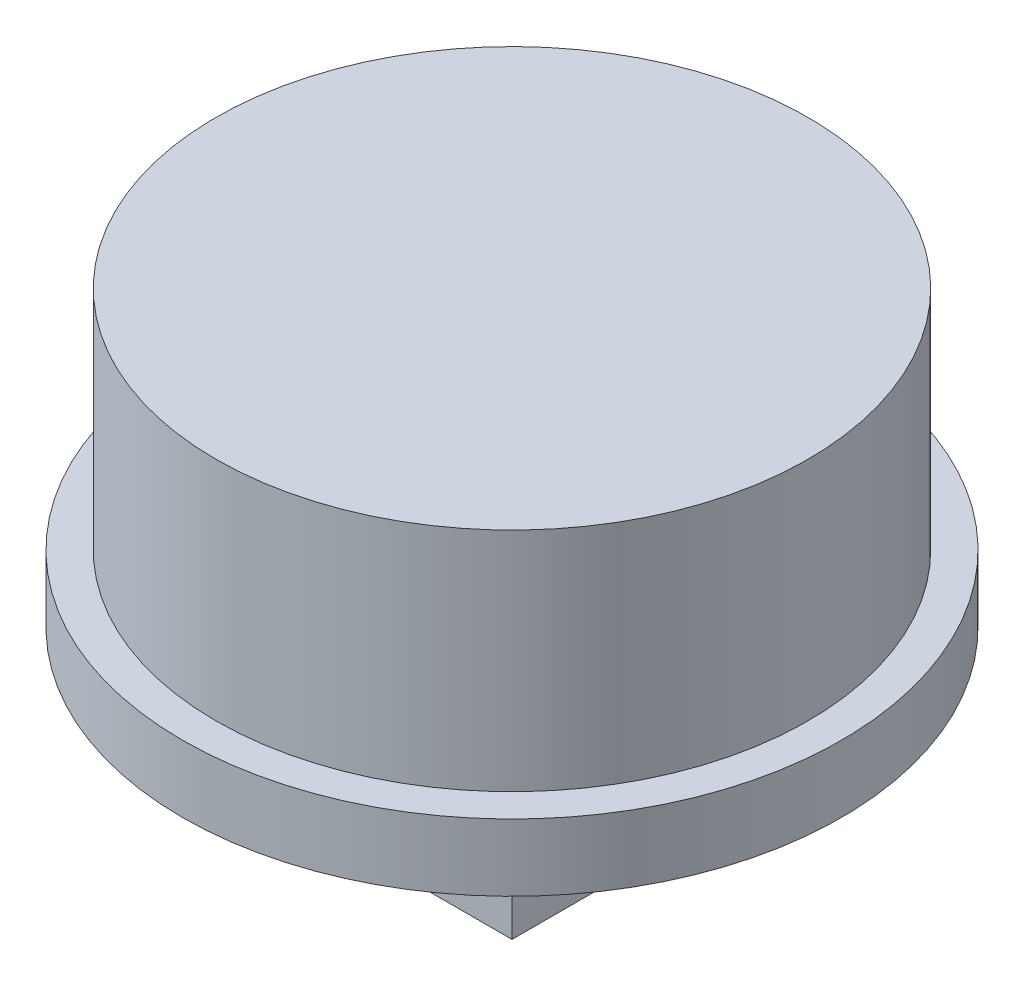
ISO-10303-21;
HEADER;
FILE_DESCRIPTION(('STEP AP214'),'2;1');
FILE_NAME('part.step','',(''),(''),'','','');
FILE_SCHEMA(('AUTOMOTIVE_DESIGN { 1 0 10303 214 1 1 1 1 }'));
ENDSEC;
DATA;
#1=APPLICATION_CONTEXT('core data for automotive mechanical design processes');
#2=APPLICATION_PROTOCOL_DEFINITION('international standard','automotive_design',2000,#1);
#3=PRODUCT_CONTEXT('',#1,'mechanical');
#4=PRODUCT('Part','Part','',(#3));
#5=PRODUCT_RELATED_PRODUCT_CATEGORY('part','',(#4));
#6=PRODUCT_DEFINITION_FORMATION('','',#4);
#7=PRODUCT_DEFINITION_CONTEXT('part definition',#1,'design');
#8=PRODUCT_DEFINITION('design','',#6,#7);
#9=PRODUCT_DEFINITION_SHAPE('','',#8);
#10=(LENGTH_UNIT() NAMED_UNIT(*) SI_UNIT(.MILLI.,.METRE.));
#11=(NAMED_UNIT(*) PLANE_ANGLE_UNIT() SI_UNIT($,.RADIAN.));
#12=(NAMED_UNIT(*) SI_UNIT($,.STERADIAN.) SOLID_ANGLE_UNIT());
#13=UNCERTAINTY_MEASURE_WITH_UNIT(LENGTH_MEASURE(1.E-05),#10,'distance_accuracy_value','');
#14=(GEOMETRIC_REPRESENTATION_CONTEXT(3) GLOBAL_UNCERTAINTY_ASSIGNED_CONTEXT((#13)) GLOBAL_UNIT_ASSIGNED_CONTEXT((#10,
#11,#12)) REPRESENTATION_CONTEXT('',''));
#15=CARTESIAN_POINT('',(0.,0.,0.));
#16=DIRECTION('',(0.,0.,1.));
#17=DIRECTION('',(1.,0.,0.));
#18=AXIS2_PLACEMENT_3D('',#15,#16,#17);
#19=CARTESIAN_POINT('',(0.,1.3,0.));
#20=DIRECTION('',(0.,-1.,0.));
#21=DIRECTION('',(0.,0.,-1.));
#22=AXIS2_PLACEMENT_3D('',#19,#20,#21);
#23=CYLINDRICAL_SURFACE('',#22,6.4);
#24=CARTESIAN_POINT('',(0.,1.3,0.));
#25=DIRECTION('',(0.,1.,0.));
#26=DIRECTION('',(0.,0.,1.));
#27=AXIS2_PLACEMENT_3D('',#24,#25,#26);
#28=CIRCLE('',#27,6.4);
#29=CARTESIAN_POINT('',(0.,1.3,6.4));
#30=VERTEX_POINT('',#29);
#31=EDGE_CURVE('E11',#30,#30,#28,.T.);
#32=ORIENTED_EDGE('',*,*,#31,.F.);
#33=EDGE_LOOP('',(#32));
#34=FACE_BOUND('',#33,.T.);
#35=CARTESIAN_POINT('',(0.,0.,0.));
#36=DIRECTION('',(0.,1.,0.));
#37=DIRECTION('',(0.,0.,1.));
#38=AXIS2_PLACEMENT_3D('',#35,#36,#37);
#39=CIRCLE('',#38,6.4);
#40=CARTESIAN_POINT('',(0.,0.,6.4));
#41=VERTEX_POINT('',#40);
#42=EDGE_CURVE('E41',#41,#41,#39,.T.);
#43=ORIENTED_EDGE('',*,*,#42,.T.);
#44=EDGE_LOOP('',(#43));
#45=FACE_BOUND('',#44,.T.);
#46=ADVANCED_FACE('F38',(#34,#45),#23,.T.);
#47=CARTESIAN_POINT('',(0.,1.3,0.));
#48=DIRECTION('',(0.,1.,0.));
#49=DIRECTION('',(0.,0.,1.));
#50=AXIS2_PLACEMENT_3D('',#47,#48,#49);
#51=PLANE('',#50);
#52=CARTESIAN_POINT('',(0.,1.3,0.));
#53=DIRECTION('',(0.,1.,0.));
#54=DIRECTION('',(0.,0.,1.));
#55=AXIS2_PLACEMENT_3D('',#52,#53,#54);
#56=CIRCLE('',#55,5.75);
#57=CARTESIAN_POINT('',(0.,1.3,5.75));
#58=VERTEX_POINT('',#57);
#59=EDGE_CURVE('E177',#58,#58,#56,.F.);
#60=ORIENTED_EDGE('',*,*,#59,.T.);
#61=EDGE_LOOP('',(#60));
#62=FACE_BOUND('',#61,.T.);
#63=ORIENTED_EDGE('',*,*,#31,.T.);
#64=EDGE_LOOP('',(#63));
#65=FACE_BOUND('',#64,.T.);
#66=ADVANCED_FACE('F188',(#62,#65),#51,.T.);
#67=CARTESIAN_POINT('',(0.,0.,0.));
#68=DIRECTION('',(0.,1.,0.));
#69=DIRECTION('',(0.,0.,1.));
#70=AXIS2_PLACEMENT_3D('',#67,#68,#69);
#71=PLANE('',#70);
#72=DIRECTION('',(-1.,0.,0.));
#73=VECTOR('',#72,1.);
#74=CARTESIAN_POINT('',(2.75,0.,-2.75));
#75=LINE('',#74,#73);
#76=CARTESIAN_POINT('',(2.75,0.,-2.75));
#77=VERTEX_POINT('',#76);
#78=CARTESIAN_POINT('',(-2.75,0.,-2.75));
#79=VERTEX_POINT('',#78);
#80=EDGE_CURVE('E149',#77,#79,#75,.T.);
#81=ORIENTED_EDGE('',*,*,#80,.T.);
#82=DIRECTION('',(0.,0.,1.));
#83=VECTOR('',#82,1.);
#84=CARTESIAN_POINT('',(-2.75,0.,-2.75));
#85=LINE('',#84,#83);
#86=CARTESIAN_POINT('',(-2.75,0.,2.75));
#87=VERTEX_POINT('',#86);
#88=EDGE_CURVE('E140',#79,#87,#85,.T.);
#89=ORIENTED_EDGE('',*,*,#88,.T.);
#90=DIRECTION('',(1.,0.,0.));
#91=VECTOR('',#90,1.);
#92=CARTESIAN_POINT('',(2.75,0.,2.75));
#93=LINE('',#92,#91);
#94=CARTESIAN_POINT('',(2.75,0.,2.75));
#95=VERTEX_POINT('',#94);
#96=EDGE_CURVE('E161',#87,#95,#93,.T.);
#97=ORIENTED_EDGE('',*,*,#96,.T.);
#98=DIRECTION('',(0.,0.,-1.));
#99=VECTOR('',#98,1.);
#100=CARTESIAN_POINT('',(2.75,0.,-2.75));
#101=LINE('',#100,#99);
#102=EDGE_CURVE('E52',#95,#77,#101,.T.);
#103=ORIENTED_EDGE('',*,*,#102,.T.);
#104=EDGE_LOOP('',(#81,#89,#97,#103));
#105=FACE_BOUND('',#104,.T.);
#106=ORIENTED_EDGE('',*,*,#42,.F.);
#107=EDGE_LOOP('',(#106));
#108=FACE_BOUND('',#107,.T.);
#109=ADVANCED_FACE('F185',(#105,#108),#71,.F.);
#110=CARTESIAN_POINT('',(0.,5.7,0.));
#111=DIRECTION('',(0.,-1.,0.));
#112=DIRECTION('',(0.,0.,-1.));
#113=AXIS2_PLACEMENT_3D('',#110,#111,#112);
#114=CYLINDRICAL_SURFACE('',#113,5.75);
#115=ORIENTED_EDGE('',*,*,#59,.F.);
#116=EDGE_LOOP('',(#115));
#117=FACE_BOUND('',#116,.T.);
#118=CARTESIAN_POINT('',(0.,5.7,0.));
#119=DIRECTION('',(0.,1.,0.));
#120=DIRECTION('',(0.,0.,1.));
#121=AXIS2_PLACEMENT_3D('',#118,#119,#120);
#122=CIRCLE('',#121,5.75);
#123=CARTESIAN_POINT('',(0.,5.7,5.75));
#124=VERTEX_POINT('',#123);
#125=EDGE_CURVE('E169',#124,#124,#122,.T.);
#126=ORIENTED_EDGE('',*,*,#125,.F.);
#127=EDGE_LOOP('',(#126));
#128=FACE_BOUND('',#127,.T.);
#129=ADVANCED_FACE('F187',(#117,#128),#114,.T.);
#130=CARTESIAN_POINT('',(0.,5.7,0.));
#131=DIRECTION('',(0.,1.,0.));
#132=DIRECTION('',(0.,0.,1.));
#133=AXIS2_PLACEMENT_3D('',#130,#131,#132);
#134=PLANE('',#133);
#135=ORIENTED_EDGE('',*,*,#125,.T.);
#136=EDGE_LOOP('',(#135));
#137=FACE_BOUND('',#136,.T.);
#138=ADVANCED_FACE('F195',(#137),#134,.T.);
#139=CARTESIAN_POINT('',(-2.75,-2.5,-2.75));
#140=DIRECTION('',(-1.,0.,0.));
#141=DIRECTION('',(0.,0.,1.));
#142=AXIS2_PLACEMENT_3D('',#139,#140,#141);
#143=PLANE('',#142);
#144=ORIENTED_EDGE('',*,*,#88,.F.);
#145=DIRECTION('',(0.,1.,0.));
#146=VECTOR('',#145,1.);
#147=CARTESIAN_POINT('',(-2.75,-2.5,-2.75));
#148=LINE('',#147,#146);
#149=CARTESIAN_POINT('',(-2.75,-2.5,-2.75));
#150=VERTEX_POINT('',#149);
#151=EDGE_CURVE('E167',#150,#79,#148,.T.);
#152=ORIENTED_EDGE('',*,*,#151,.F.);
#153=DIRECTION('',(0.,0.,1.));
#154=VECTOR('',#153,1.);
#155=CARTESIAN_POINT('',(-2.75,-2.5,-2.75));
#156=LINE('',#155,#154);
#157=CARTESIAN_POINT('',(-2.75,-2.5,2.75));
#158=VERTEX_POINT('',#157);
#159=EDGE_CURVE('E145',#150,#158,#156,.T.);
#160=ORIENTED_EDGE('',*,*,#159,.T.);
#161=DIRECTION('',(0.,1.,0.));
#162=VECTOR('',#161,1.);
#163=CARTESIAN_POINT('',(-2.75,-2.5,2.75));
#164=LINE('',#163,#162);
#165=EDGE_CURVE('E158',#158,#87,#164,.T.);
#166=ORIENTED_EDGE('',*,*,#165,.T.);
#167=EDGE_LOOP('',(#144,#152,#160,#166));
#168=FACE_BOUND('',#167,.T.);
#169=ADVANCED_FACE('F225',(#168),#143,.T.);
#170=CARTESIAN_POINT('',(2.75,-2.5,-2.75));
#171=DIRECTION('',(0.,0.,-1.));
#172=DIRECTION('',(-1.,0.,0.));
#173=AXIS2_PLACEMENT_3D('',#170,#171,#172);
#174=PLANE('',#173);
#175=ORIENTED_EDGE('',*,*,#80,.F.);
#176=DIRECTION('',(0.,1.,0.));
#177=VECTOR('',#176,1.);
#178=CARTESIAN_POINT('',(2.75,-2.5,-2.75));
#179=LINE('',#178,#177);
#180=CARTESIAN_POINT('',(2.75,-2.5,-2.75));
#181=VERTEX_POINT('',#180);
#182=EDGE_CURVE('E170',#181,#77,#179,.T.);
#183=ORIENTED_EDGE('',*,*,#182,.F.);
#184=DIRECTION('',(-1.,0.,0.));
#185=VECTOR('',#184,1.);
#186=CARTESIAN_POINT('',(2.75,-2.5,-2.75));
#187=LINE('',#186,#185);
#188=EDGE_CURVE('E155',#181,#150,#187,.T.);
#189=ORIENTED_EDGE('',*,*,#188,.T.);
#190=ORIENTED_EDGE('',*,*,#151,.T.);
#191=EDGE_LOOP('',(#175,#183,#189,#190));
#192=FACE_BOUND('',#191,.T.);
#193=ADVANCED_FACE('F240',(#192),#174,.T.);
#194=CARTESIAN_POINT('',(2.75,-2.5,-2.75));
#195=DIRECTION('',(1.,0.,0.));
#196=DIRECTION('',(0.,0.,-1.));
#197=AXIS2_PLACEMENT_3D('',#194,#195,#196);
#198=PLANE('',#197);
#199=ORIENTED_EDGE('',*,*,#102,.F.);
#200=DIRECTION('',(0.,1.,0.));
#201=VECTOR('',#200,1.);
#202=CARTESIAN_POINT('',(2.75,-2.5,2.75));
#203=LINE('',#202,#201);
#204=CARTESIAN_POINT('',(2.75,-2.5,2.75));
#205=VERTEX_POINT('',#204);
#206=EDGE_CURVE('E172',#205,#95,#203,.T.);
#207=ORIENTED_EDGE('',*,*,#206,.F.);
#208=DIRECTION('',(0.,0.,-1.));
#209=VECTOR('',#208,1.);
#210=CARTESIAN_POINT('',(2.75,-2.5,-2.75));
#211=LINE('',#210,#209);
#212=EDGE_CURVE('E152',#205,#181,#211,.T.);
#213=ORIENTED_EDGE('',*,*,#212,.T.);
#214=ORIENTED_EDGE('',*,*,#182,.T.);
#215=EDGE_LOOP('',(#199,#207,#213,#214));
#216=FACE_BOUND('',#215,.T.);
#217=ADVANCED_FACE('F250',(#216),#198,.T.);
#218=CARTESIAN_POINT('',(2.75,-2.5,2.75));
#219=DIRECTION('',(0.,0.,1.));
#220=DIRECTION('',(1.,0.,0.));
#221=AXIS2_PLACEMENT_3D('',#218,#219,#220);
#222=PLANE('',#221);
#223=ORIENTED_EDGE('',*,*,#96,.F.);
#224=ORIENTED_EDGE('',*,*,#165,.F.);
#225=DIRECTION('',(1.,0.,0.));
#226=VECTOR('',#225,1.);
#227=CARTESIAN_POINT('',(2.75,-2.5,2.75));
#228=LINE('',#227,#226);
#229=EDGE_CURVE('E148',#158,#205,#228,.T.);
#230=ORIENTED_EDGE('',*,*,#229,.T.);
#231=ORIENTED_EDGE('',*,*,#206,.T.);
#232=EDGE_LOOP('',(#223,#224,#230,#231));
#233=FACE_BOUND('',#232,.T.);
#234=ADVANCED_FACE('F260',(#233),#222,.T.);
#235=CARTESIAN_POINT('',(0.,-2.5,0.));
#236=DIRECTION('',(0.,-1.,0.));
#237=DIRECTION('',(0.,0.,-1.));
#238=AXIS2_PLACEMENT_3D('',#235,#236,#237);
#239=PLANE('',#238);
#240=DIRECTION('',(0.,0.,1.));
#241=VECTOR('',#240,1.);
#242=CARTESIAN_POINT('',(-1.9,-2.5,-1.9));
#243=LINE('',#242,#241);
#244=CARTESIAN_POINT('',(-1.9,-2.5,-1.9));
#245=VERTEX_POINT('',#244);
#246=CARTESIAN_POINT('',(-1.9,-2.5,1.9));
#247=VERTEX_POINT('',#246);
#248=EDGE_CURVE('E106',#245,#247,#243,.T.);
#249=ORIENTED_EDGE('',*,*,#248,.T.);
#250=DIRECTION('',(1.,0.,0.));
#251=VECTOR('',#250,1.);
#252=CARTESIAN_POINT('',(1.9,-2.5,1.9));
#253=LINE('',#252,#251);
#254=CARTESIAN_POINT('',(1.9,-2.5,1.9));
#255=VERTEX_POINT('',#254);
#256=EDGE_CURVE('E115',#247,#255,#253,.T.);
#257=ORIENTED_EDGE('',*,*,#256,.T.);
#258=DIRECTION('',(0.,0.,-1.));
#259=VECTOR('',#258,1.);
#260=CARTESIAN_POINT('',(1.9,-2.5,-1.9));
#261=LINE('',#260,#259);
#262=CARTESIAN_POINT('',(1.9,-2.5,-1.9));
#263=VERTEX_POINT('',#262);
#264=EDGE_CURVE('E120',#255,#263,#261,.T.);
#265=ORIENTED_EDGE('',*,*,#264,.T.);
#266=DIRECTION('',(-1.,0.,0.));
#267=VECTOR('',#266,1.);
#268=CARTESIAN_POINT('',(1.9,-2.5,-1.9));
#269=LINE('',#268,#267);
#270=EDGE_CURVE('E111',#263,#245,#269,.T.);
#271=ORIENTED_EDGE('',*,*,#270,.T.);
#272=EDGE_LOOP('',(#249,#257,#265,#271));
#273=FACE_BOUND('',#272,.T.);
#274=ORIENTED_EDGE('',*,*,#159,.F.);
#275=ORIENTED_EDGE('',*,*,#188,.F.);
#276=ORIENTED_EDGE('',*,*,#212,.F.);
#277=ORIENTED_EDGE('',*,*,#229,.F.);
#278=EDGE_LOOP('',(#274,#275,#276,#277));
#279=FACE_BOUND('',#278,.T.);
#280=ADVANCED_FACE('F122',(#273,#279),#239,.T.);
#281=CARTESIAN_POINT('',(-1.9,-2.5,-1.9));
#282=DIRECTION('',(-1.,0.,0.));
#283=DIRECTION('',(0.,0.,1.));
#284=AXIS2_PLACEMENT_3D('',#281,#282,#283);
#285=PLANE('',#284);
#286=DIRECTION('',(0.,0.,1.));
#287=VECTOR('',#286,1.);
#288=CARTESIAN_POINT('',(-1.9,0.,-1.9));
#289=LINE('',#288,#287);
#290=CARTESIAN_POINT('',(-1.9,0.,-1.9));
#291=VERTEX_POINT('',#290);
#292=CARTESIAN_POINT('',(-1.9,0.,1.9));
#293=VERTEX_POINT('',#292);
#294=EDGE_CURVE('E60',#291,#293,#289,.T.);
#295=ORIENTED_EDGE('',*,*,#294,.T.);
#296=DIRECTION('',(0.,1.,0.));
#297=VECTOR('',#296,1.);
#298=CARTESIAN_POINT('',(-1.9,-2.5,1.9));
#299=LINE('',#298,#297);
#300=EDGE_CURVE('E102',#247,#293,#299,.T.);
#301=ORIENTED_EDGE('',*,*,#300,.F.);
#302=ORIENTED_EDGE('',*,*,#248,.F.);
#303=DIRECTION('',(0.,1.,0.));
#304=VECTOR('',#303,1.);
#305=CARTESIAN_POINT('',(-1.9,-2.5,-1.9));
#306=LINE('',#305,#304);
#307=EDGE_CURVE('E138',#245,#291,#306,.T.);
#308=ORIENTED_EDGE('',*,*,#307,.T.);
#309=EDGE_LOOP('',(#295,#301,#302,#308));
#310=FACE_BOUND('',#309,.T.);
#311=ADVANCED_FACE('F104',(#310),#285,.F.);
#312=CARTESIAN_POINT('',(1.9,-2.5,-1.9));
#313=DIRECTION('',(0.,0.,-1.));
#314=DIRECTION('',(-1.,0.,0.));
#315=AXIS2_PLACEMENT_3D('',#312,#313,#314);
#316=PLANE('',#315);
#317=DIRECTION('',(-1.,0.,0.));
#318=VECTOR('',#317,1.);
#319=CARTESIAN_POINT('',(1.9,0.,-1.9));
#320=LINE('',#319,#318);
#321=CARTESIAN_POINT('',(1.9,0.,-1.9));
#322=VERTEX_POINT('',#321);
#323=EDGE_CURVE('E125',#322,#291,#320,.T.);
#324=ORIENTED_EDGE('',*,*,#323,.T.);
#325=ORIENTED_EDGE('',*,*,#307,.F.);
#326=ORIENTED_EDGE('',*,*,#270,.F.);
#327=DIRECTION('',(0.,1.,0.));
#328=VECTOR('',#327,1.);
#329=CARTESIAN_POINT('',(1.9,-2.5,-1.9));
#330=LINE('',#329,#328);
#331=EDGE_CURVE('E141',#263,#322,#330,.T.);
#332=ORIENTED_EDGE('',*,*,#331,.T.);
#333=EDGE_LOOP('',(#324,#325,#326,#332));
#334=FACE_BOUND('',#333,.T.);
#335=ADVANCED_FACE('F286',(#334),#316,.F.);
#336=CARTESIAN_POINT('',(1.9,-2.5,-1.9));
#337=DIRECTION('',(1.,0.,0.));
#338=DIRECTION('',(0.,0.,-1.));
#339=AXIS2_PLACEMENT_3D('',#336,#337,#338);
#340=PLANE('',#339);
#341=DIRECTION('',(0.,0.,-1.));
#342=VECTOR('',#341,1.);
#343=CARTESIAN_POINT('',(1.9,0.,-1.9));
#344=LINE('',#343,#342);
#345=CARTESIAN_POINT('',(1.9,0.,1.9));
#346=VERTEX_POINT('',#345);
#347=EDGE_CURVE('E128',#346,#322,#344,.T.);
#348=ORIENTED_EDGE('',*,*,#347,.T.);
#349=ORIENTED_EDGE('',*,*,#331,.F.);
#350=ORIENTED_EDGE('',*,*,#264,.F.);
#351=DIRECTION('',(0.,1.,0.));
#352=VECTOR('',#351,1.);
#353=CARTESIAN_POINT('',(1.9,-2.5,1.9));
#354=LINE('',#353,#352);
#355=EDGE_CURVE('E110',#255,#346,#354,.T.);
#356=ORIENTED_EDGE('',*,*,#355,.T.);
#357=EDGE_LOOP('',(#348,#349,#350,#356));
#358=FACE_BOUND('',#357,.T.);
#359=ADVANCED_FACE('F295',(#358),#340,.F.);
#360=CARTESIAN_POINT('',(1.9,-2.5,1.9));
#361=DIRECTION('',(0.,0.,1.));
#362=DIRECTION('',(1.,0.,0.));
#363=AXIS2_PLACEMENT_3D('',#360,#361,#362);
#364=PLANE('',#363);
#365=DIRECTION('',(1.,0.,0.));
#366=VECTOR('',#365,1.);
#367=CARTESIAN_POINT('',(1.9,0.,1.9));
#368=LINE('',#367,#366);
#369=EDGE_CURVE('E134',#293,#346,#368,.T.);
#370=ORIENTED_EDGE('',*,*,#369,.T.);
#371=ORIENTED_EDGE('',*,*,#355,.F.);
#372=ORIENTED_EDGE('',*,*,#256,.F.);
#373=ORIENTED_EDGE('',*,*,#300,.T.);
#374=EDGE_LOOP('',(#370,#371,#372,#373));
#375=FACE_BOUND('',#374,.T.);
#376=ADVANCED_FACE('F116',(#375),#364,.F.);
#377=ORIENTED_EDGE('',*,*,#294,.F.);
#378=ORIENTED_EDGE('',*,*,#323,.F.);
#379=ORIENTED_EDGE('',*,*,#347,.F.);
#380=ORIENTED_EDGE('',*,*,#369,.F.);
#381=EDGE_LOOP('',(#377,#378,#379,#380));
#382=FACE_BOUND('',#381,.T.);
#383=ADVANCED_FACE('F190',(#382),#71,.F.);
#384=CLOSED_SHELL('',(#46,#66,#109,#129,#138,#169,#193,#217,#234,#280,#311,#335,#359,#376,#383));
#385=MANIFOLD_SOLID_BREP('B2',#384);
#386=ADVANCED_BREP_SHAPE_REPRESENTATION('',(#18,#385),#14);
#387=SHAPE_DEFINITION_REPRESENTATION(#9,#386);
ENDSEC;
END-ISO-10303-21;
